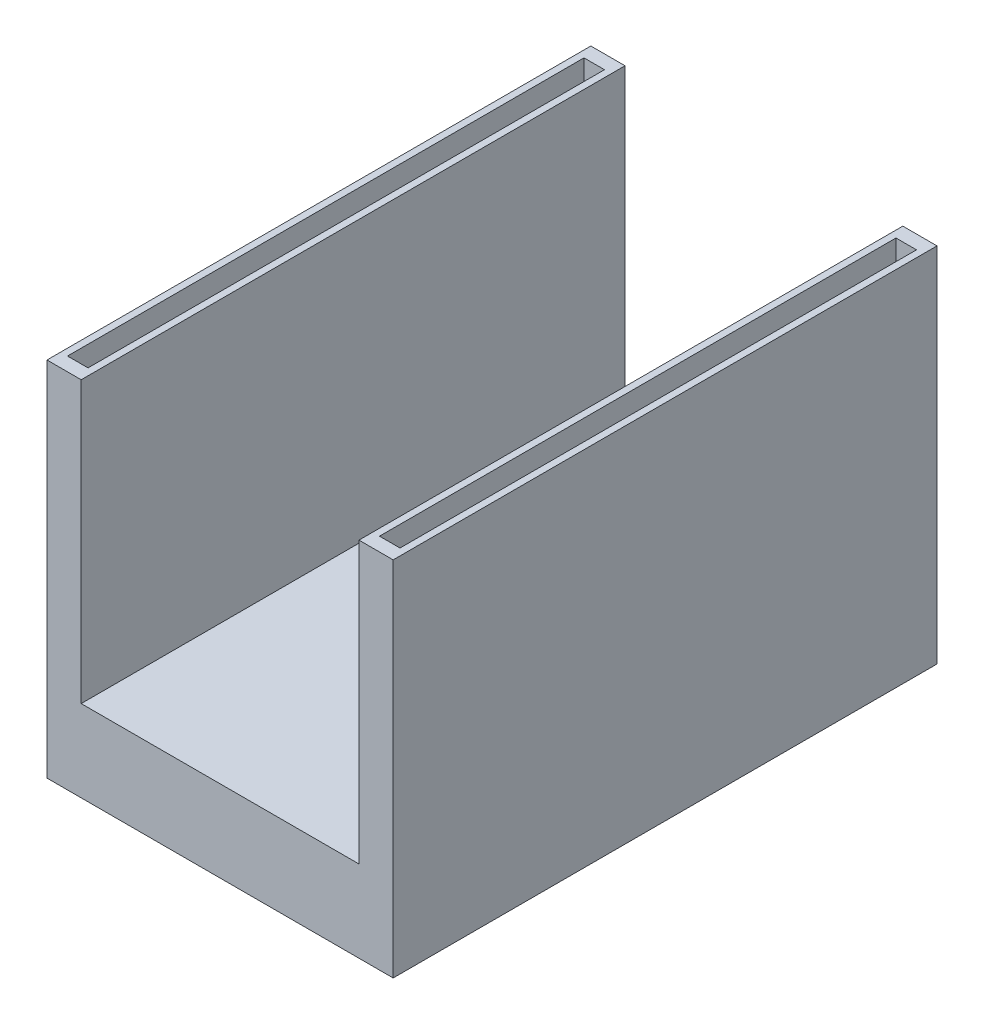
ISO-10303-21;
HEADER;
FILE_DESCRIPTION(('STEP AP214'),'2;1');
FILE_NAME('part.step','',(''),(''),'','','');
FILE_SCHEMA(('AUTOMOTIVE_DESIGN { 1 0 10303 214 1 1 1 1 }'));
ENDSEC;
DATA;
#1=APPLICATION_CONTEXT('core data for automotive mechanical design processes');
#2=APPLICATION_PROTOCOL_DEFINITION('international standard','automotive_design',2000,#1);
#3=PRODUCT_CONTEXT('',#1,'mechanical');
#4=PRODUCT('Part','Part','',(#3));
#5=PRODUCT_RELATED_PRODUCT_CATEGORY('part','',(#4));
#6=PRODUCT_DEFINITION_FORMATION('','',#4);
#7=PRODUCT_DEFINITION_CONTEXT('part definition',#1,'design');
#8=PRODUCT_DEFINITION('design','',#6,#7);
#9=PRODUCT_DEFINITION_SHAPE('','',#8);
#10=(LENGTH_UNIT() NAMED_UNIT(*) SI_UNIT(.MILLI.,.METRE.));
#11=(NAMED_UNIT(*) PLANE_ANGLE_UNIT() SI_UNIT($,.RADIAN.));
#12=(NAMED_UNIT(*) SI_UNIT($,.STERADIAN.) SOLID_ANGLE_UNIT());
#13=UNCERTAINTY_MEASURE_WITH_UNIT(LENGTH_MEASURE(1.E-05),#10,'distance_accuracy_value','');
#14=(GEOMETRIC_REPRESENTATION_CONTEXT(3) GLOBAL_UNCERTAINTY_ASSIGNED_CONTEXT((#13)) GLOBAL_UNIT_ASSIGNED_CONTEXT((#10,
#11,#12)) REPRESENTATION_CONTEXT('',''));
#15=CARTESIAN_POINT('',(0.,0.,0.));
#16=DIRECTION('',(0.,0.,1.));
#17=DIRECTION('',(1.,0.,0.));
#18=AXIS2_PLACEMENT_3D('',#15,#16,#17);
#19=CARTESIAN_POINT('',(101.212923353265,0.,159.));
#20=DIRECTION('',(0.,1.,0.));
#21=DIRECTION('',(-1.,0.,0.));
#22=AXIS2_PLACEMENT_3D('',#19,#20,#21);
#23=PLANE('',#22);
#24=DIRECTION('',(1.,0.,0.));
#25=VECTOR('',#24,1.);
#26=CARTESIAN_POINT('',(101.212923353265,0.,0.));
#27=LINE('',#26,#25);
#28=CARTESIAN_POINT('',(0.,0.,0.));
#29=VERTEX_POINT('',#28);
#30=CARTESIAN_POINT('',(101.212923353265,0.,0.));
#31=VERTEX_POINT('',#30);
#32=EDGE_CURVE('E208',#29,#31,#27,.T.);
#33=ORIENTED_EDGE('',*,*,#32,.T.);
#34=DIRECTION('',(0.,0.,-1.));
#35=VECTOR('',#34,1.);
#36=CARTESIAN_POINT('',(101.212923353265,0.,159.));
#37=LINE('',#36,#35);
#38=CARTESIAN_POINT('',(101.212923353265,0.,159.));
#39=VERTEX_POINT('',#38);
#40=EDGE_CURVE('E11',#39,#31,#37,.T.);
#41=ORIENTED_EDGE('',*,*,#40,.F.);
#42=DIRECTION('',(1.,0.,0.));
#43=VECTOR('',#42,1.);
#44=CARTESIAN_POINT('',(101.212923353265,0.,159.));
#45=LINE('',#44,#43);
#46=CARTESIAN_POINT('',(0.,0.,159.));
#47=VERTEX_POINT('',#46);
#48=EDGE_CURVE('E214',#47,#39,#45,.T.);
#49=ORIENTED_EDGE('',*,*,#48,.F.);
#50=DIRECTION('',(0.,0.,-1.));
#51=VECTOR('',#50,1.);
#52=CARTESIAN_POINT('',(0.,0.,159.));
#53=LINE('',#52,#51);
#54=EDGE_CURVE('E232',#47,#29,#53,.T.);
#55=ORIENTED_EDGE('',*,*,#54,.T.);
#56=EDGE_LOOP('',(#33,#41,#49,#55));
#57=FACE_BOUND('',#56,.T.);
#58=ADVANCED_FACE('F33',(#57),#23,.F.);
#59=CARTESIAN_POINT('',(101.212923353265,105.870341046064,159.));
#60=DIRECTION('',(-1.,0.,0.));
#61=DIRECTION('',(0.,-1.,0.));
#62=AXIS2_PLACEMENT_3D('',#59,#60,#61);
#63=PLANE('',#62);
#64=DIRECTION('',(0.,1.,0.));
#65=VECTOR('',#64,1.);
#66=CARTESIAN_POINT('',(101.212923353265,105.870341046064,0.));
#67=LINE('',#66,#65);
#68=CARTESIAN_POINT('',(101.212923353265,105.870341046064,0.));
#69=VERTEX_POINT('',#68);
#70=EDGE_CURVE('E235',#31,#69,#67,.T.);
#71=ORIENTED_EDGE('',*,*,#70,.T.);
#72=DIRECTION('',(0.,0.,-1.));
#73=VECTOR('',#72,1.);
#74=CARTESIAN_POINT('',(101.212923353265,105.870341046064,159.));
#75=LINE('',#74,#73);
#76=CARTESIAN_POINT('',(101.212923353265,105.870341046064,159.));
#77=VERTEX_POINT('',#76);
#78=EDGE_CURVE('E40',#77,#69,#75,.T.);
#79=ORIENTED_EDGE('',*,*,#78,.F.);
#80=DIRECTION('',(0.,1.,0.));
#81=VECTOR('',#80,1.);
#82=CARTESIAN_POINT('',(101.212923353265,105.870341046064,159.));
#83=LINE('',#82,#81);
#84=EDGE_CURVE('E217',#39,#77,#83,.T.);
#85=ORIENTED_EDGE('',*,*,#84,.F.);
#86=ORIENTED_EDGE('',*,*,#40,.T.);
#87=EDGE_LOOP('',(#71,#79,#85,#86));
#88=FACE_BOUND('',#87,.T.);
#89=ADVANCED_FACE('F292',(#88),#63,.F.);
#90=CARTESIAN_POINT('',(91.212923353265,105.870341046064,159.));
#91=DIRECTION('',(0.,-1.,0.));
#92=DIRECTION('',(0.,0.,-1.));
#93=AXIS2_PLACEMENT_3D('',#90,#91,#92);
#94=PLANE('',#93);
#95=DIRECTION('',(1.,0.,0.));
#96=VECTOR('',#95,1.);
#97=CARTESIAN_POINT('',(93.212923353265,105.870341046064,155.));
#98=LINE('',#97,#96);
#99=CARTESIAN_POINT('',(93.212923353265,105.870341046064,155.));
#100=VERTEX_POINT('',#99);
#101=CARTESIAN_POINT('',(99.212923353265,105.870341046064,155.));
#102=VERTEX_POINT('',#101);
#103=EDGE_CURVE('E174',#100,#102,#98,.T.);
#104=ORIENTED_EDGE('',*,*,#103,.F.);
#105=DIRECTION('',(0.,0.,1.));
#106=VECTOR('',#105,1.);
#107=CARTESIAN_POINT('',(93.212923353265,105.870341046064,4.));
#108=LINE('',#107,#106);
#109=CARTESIAN_POINT('',(93.212923353265,105.870341046064,4.));
#110=VERTEX_POINT('',#109);
#111=EDGE_CURVE('E47',#110,#100,#108,.T.);
#112=ORIENTED_EDGE('',*,*,#111,.F.);
#113=DIRECTION('',(-1.,0.,0.));
#114=VECTOR('',#113,1.);
#115=CARTESIAN_POINT('',(93.212923353265,105.870341046064,4.));
#116=LINE('',#115,#114);
#117=CARTESIAN_POINT('',(99.212923353265,105.870341046064,4.));
#118=VERTEX_POINT('',#117);
#119=EDGE_CURVE('E165',#118,#110,#116,.T.);
#120=ORIENTED_EDGE('',*,*,#119,.F.);
#121=DIRECTION('',(0.,0.,-1.));
#122=VECTOR('',#121,1.);
#123=CARTESIAN_POINT('',(99.212923353265,105.870341046064,4.));
#124=LINE('',#123,#122);
#125=EDGE_CURVE('E168',#102,#118,#124,.T.);
#126=ORIENTED_EDGE('',*,*,#125,.F.);
#127=EDGE_LOOP('',(#104,#112,#120,#126));
#128=FACE_BOUND('',#127,.T.);
#129=DIRECTION('',(-1.,0.,0.));
#130=VECTOR('',#129,1.);
#131=CARTESIAN_POINT('',(91.212923353265,105.870341046064,0.));
#132=LINE('',#131,#130);
#133=CARTESIAN_POINT('',(91.212923353265,105.870341046064,0.));
#134=VERTEX_POINT('',#133);
#135=EDGE_CURVE('E237',#69,#134,#132,.T.);
#136=ORIENTED_EDGE('',*,*,#135,.T.);
#137=DIRECTION('',(0.,0.,-1.));
#138=VECTOR('',#137,1.);
#139=CARTESIAN_POINT('',(91.212923353265,105.870341046064,159.));
#140=LINE('',#139,#138);
#141=CARTESIAN_POINT('',(91.212923353265,105.870341046064,159.));
#142=VERTEX_POINT('',#141);
#143=EDGE_CURVE('E262',#142,#134,#140,.T.);
#144=ORIENTED_EDGE('',*,*,#143,.F.);
#145=DIRECTION('',(-1.,0.,0.));
#146=VECTOR('',#145,1.);
#147=CARTESIAN_POINT('',(91.212923353265,105.870341046064,159.));
#148=LINE('',#147,#146);
#149=EDGE_CURVE('E220',#77,#142,#148,.T.);
#150=ORIENTED_EDGE('',*,*,#149,.F.);
#151=ORIENTED_EDGE('',*,*,#78,.T.);
#152=EDGE_LOOP('',(#136,#144,#150,#151));
#153=FACE_BOUND('',#152,.T.);
#154=ADVANCED_FACE('F269',(#128,#153),#94,.F.);
#155=CARTESIAN_POINT('',(91.212923353265,23.87275176668,159.));
#156=DIRECTION('',(1.,0.,0.));
#157=DIRECTION('',(0.,0.,-1.));
#158=AXIS2_PLACEMENT_3D('',#155,#156,#157);
#159=PLANE('',#158);
#160=DIRECTION('',(0.,-1.,0.));
#161=VECTOR('',#160,1.);
#162=CARTESIAN_POINT('',(91.212923353265,23.87275176668,0.));
#163=LINE('',#162,#161);
#164=CARTESIAN_POINT('',(91.212923353265,23.87275176668,0.));
#165=VERTEX_POINT('',#164);
#166=EDGE_CURVE('E239',#134,#165,#163,.T.);
#167=ORIENTED_EDGE('',*,*,#166,.T.);
#168=DIRECTION('',(0.,0.,-1.));
#169=VECTOR('',#168,1.);
#170=CARTESIAN_POINT('',(91.212923353265,23.87275176668,159.));
#171=LINE('',#170,#169);
#172=CARTESIAN_POINT('',(91.212923353265,23.87275176668,159.));
#173=VERTEX_POINT('',#172);
#174=EDGE_CURVE('E259',#173,#165,#171,.T.);
#175=ORIENTED_EDGE('',*,*,#174,.F.);
#176=DIRECTION('',(0.,-1.,0.));
#177=VECTOR('',#176,1.);
#178=CARTESIAN_POINT('',(91.212923353265,23.87275176668,159.));
#179=LINE('',#178,#177);
#180=EDGE_CURVE('E222',#142,#173,#179,.T.);
#181=ORIENTED_EDGE('',*,*,#180,.F.);
#182=ORIENTED_EDGE('',*,*,#143,.T.);
#183=EDGE_LOOP('',(#167,#175,#181,#182));
#184=FACE_BOUND('',#183,.T.);
#185=ADVANCED_FACE('F280',(#184),#159,.F.);
#186=CARTESIAN_POINT('',(10.,23.87275176668,159.));
#187=DIRECTION('',(0.,-1.,0.));
#188=DIRECTION('',(0.,0.,-1.));
#189=AXIS2_PLACEMENT_3D('',#186,#187,#188);
#190=PLANE('',#189);
#191=DIRECTION('',(-1.,0.,0.));
#192=VECTOR('',#191,1.);
#193=CARTESIAN_POINT('',(10.,23.87275176668,0.));
#194=LINE('',#193,#192);
#195=CARTESIAN_POINT('',(10.,23.87275176668,0.));
#196=VERTEX_POINT('',#195);
#197=EDGE_CURVE('E241',#165,#196,#194,.T.);
#198=ORIENTED_EDGE('',*,*,#197,.T.);
#199=DIRECTION('',(0.,0.,-1.));
#200=VECTOR('',#199,1.);
#201=CARTESIAN_POINT('',(10.,23.87275176668,159.));
#202=LINE('',#201,#200);
#203=CARTESIAN_POINT('',(10.,23.87275176668,159.));
#204=VERTEX_POINT('',#203);
#205=EDGE_CURVE('E256',#204,#196,#202,.T.);
#206=ORIENTED_EDGE('',*,*,#205,.F.);
#207=DIRECTION('',(-1.,0.,0.));
#208=VECTOR('',#207,1.);
#209=CARTESIAN_POINT('',(10.,23.87275176668,159.));
#210=LINE('',#209,#208);
#211=EDGE_CURVE('E224',#173,#204,#210,.T.);
#212=ORIENTED_EDGE('',*,*,#211,.F.);
#213=ORIENTED_EDGE('',*,*,#174,.T.);
#214=EDGE_LOOP('',(#198,#206,#212,#213));
#215=FACE_BOUND('',#214,.T.);
#216=ADVANCED_FACE('F284',(#215),#190,.F.);
#217=CARTESIAN_POINT('',(10.,105.870341046064,159.));
#218=DIRECTION('',(-1.,0.,0.));
#219=DIRECTION('',(0.,0.,1.));
#220=AXIS2_PLACEMENT_3D('',#217,#218,#219);
#221=PLANE('',#220);
#222=DIRECTION('',(0.,1.,0.));
#223=VECTOR('',#222,1.);
#224=CARTESIAN_POINT('',(10.,105.870341046064,0.));
#225=LINE('',#224,#223);
#226=CARTESIAN_POINT('',(10.,105.870341046064,0.));
#227=VERTEX_POINT('',#226);
#228=EDGE_CURVE('E243',#196,#227,#225,.T.);
#229=ORIENTED_EDGE('',*,*,#228,.T.);
#230=DIRECTION('',(0.,0.,-1.));
#231=VECTOR('',#230,1.);
#232=CARTESIAN_POINT('',(10.,105.870341046064,159.));
#233=LINE('',#232,#231);
#234=CARTESIAN_POINT('',(10.,105.870341046064,159.));
#235=VERTEX_POINT('',#234);
#236=EDGE_CURVE('E253',#235,#227,#233,.T.);
#237=ORIENTED_EDGE('',*,*,#236,.F.);
#238=DIRECTION('',(0.,1.,0.));
#239=VECTOR('',#238,1.);
#240=CARTESIAN_POINT('',(10.,105.870341046064,159.));
#241=LINE('',#240,#239);
#242=EDGE_CURVE('E226',#204,#235,#241,.T.);
#243=ORIENTED_EDGE('',*,*,#242,.F.);
#244=ORIENTED_EDGE('',*,*,#205,.T.);
#245=EDGE_LOOP('',(#229,#237,#243,#244));
#246=FACE_BOUND('',#245,.T.);
#247=ADVANCED_FACE('F305',(#246),#221,.F.);
#248=CARTESIAN_POINT('',(0.,105.870341046064,159.));
#249=DIRECTION('',(0.,-1.,0.));
#250=DIRECTION('',(0.,0.,-1.));
#251=AXIS2_PLACEMENT_3D('',#248,#249,#250);
#252=PLANE('',#251);
#253=DIRECTION('',(1.,0.,0.));
#254=VECTOR('',#253,1.);
#255=CARTESIAN_POINT('',(2.00000000000002,105.870341046064,155.));
#256=LINE('',#255,#254);
#257=CARTESIAN_POINT('',(2.00000000000002,105.870341046064,155.));
#258=VERTEX_POINT('',#257);
#259=CARTESIAN_POINT('',(8.00000000000002,105.870341046064,155.));
#260=VERTEX_POINT('',#259);
#261=EDGE_CURVE('E198',#258,#260,#256,.T.);
#262=ORIENTED_EDGE('',*,*,#261,.F.);
#263=DIRECTION('',(0.,0.,1.));
#264=VECTOR('',#263,1.);
#265=CARTESIAN_POINT('',(2.,105.870341046064,4.));
#266=LINE('',#265,#264);
#267=CARTESIAN_POINT('',(2.,105.870341046064,4.));
#268=VERTEX_POINT('',#267);
#269=EDGE_CURVE('E55',#268,#258,#266,.T.);
#270=ORIENTED_EDGE('',*,*,#269,.F.);
#271=DIRECTION('',(-1.,0.,0.));
#272=VECTOR('',#271,1.);
#273=CARTESIAN_POINT('',(2.,105.870341046064,4.));
#274=LINE('',#273,#272);
#275=CARTESIAN_POINT('',(8.,105.870341046064,4.));
#276=VERTEX_POINT('',#275);
#277=EDGE_CURVE('E187',#276,#268,#274,.T.);
#278=ORIENTED_EDGE('',*,*,#277,.F.);
#279=DIRECTION('',(0.,0.,-1.));
#280=VECTOR('',#279,1.);
#281=CARTESIAN_POINT('',(8.,105.870341046064,4.));
#282=LINE('',#281,#280);
#283=EDGE_CURVE('E201',#260,#276,#282,.T.);
#284=ORIENTED_EDGE('',*,*,#283,.F.);
#285=EDGE_LOOP('',(#262,#270,#278,#284));
#286=FACE_BOUND('',#285,.T.);
#287=DIRECTION('',(-1.,0.,0.));
#288=VECTOR('',#287,1.);
#289=CARTESIAN_POINT('',(0.,105.870341046064,0.));
#290=LINE('',#289,#288);
#291=CARTESIAN_POINT('',(0.,105.870341046064,0.));
#292=VERTEX_POINT('',#291);
#293=EDGE_CURVE('E245',#227,#292,#290,.T.);
#294=ORIENTED_EDGE('',*,*,#293,.T.);
#295=DIRECTION('',(0.,0.,-1.));
#296=VECTOR('',#295,1.);
#297=CARTESIAN_POINT('',(0.,105.870341046064,159.));
#298=LINE('',#297,#296);
#299=CARTESIAN_POINT('',(0.,105.870341046064,159.));
#300=VERTEX_POINT('',#299);
#301=EDGE_CURVE('E250',#300,#292,#298,.T.);
#302=ORIENTED_EDGE('',*,*,#301,.F.);
#303=DIRECTION('',(-1.,0.,0.));
#304=VECTOR('',#303,1.);
#305=CARTESIAN_POINT('',(0.,105.870341046064,159.));
#306=LINE('',#305,#304);
#307=EDGE_CURVE('E228',#235,#300,#306,.T.);
#308=ORIENTED_EDGE('',*,*,#307,.F.);
#309=ORIENTED_EDGE('',*,*,#236,.T.);
#310=EDGE_LOOP('',(#294,#302,#308,#309));
#311=FACE_BOUND('',#310,.T.);
#312=ADVANCED_FACE('F303',(#286,#311),#252,.F.);
#313=CARTESIAN_POINT('',(0.,0.,159.));
#314=DIRECTION('',(1.,0.,0.));
#315=DIRECTION('',(0.,0.,-1.));
#316=AXIS2_PLACEMENT_3D('',#313,#314,#315);
#317=PLANE('',#316);
#318=DIRECTION('',(0.,-1.,0.));
#319=VECTOR('',#318,1.);
#320=CARTESIAN_POINT('',(0.,0.,0.));
#321=LINE('',#320,#319);
#322=EDGE_CURVE('E218',#292,#29,#321,.T.);
#323=ORIENTED_EDGE('',*,*,#322,.T.);
#324=ORIENTED_EDGE('',*,*,#54,.F.);
#325=DIRECTION('',(0.,-1.,0.));
#326=VECTOR('',#325,1.);
#327=CARTESIAN_POINT('',(0.,0.,159.));
#328=LINE('',#327,#326);
#329=EDGE_CURVE('E230',#300,#47,#328,.T.);
#330=ORIENTED_EDGE('',*,*,#329,.F.);
#331=ORIENTED_EDGE('',*,*,#301,.T.);
#332=EDGE_LOOP('',(#323,#324,#330,#331));
#333=FACE_BOUND('',#332,.T.);
#334=ADVANCED_FACE('F298',(#333),#317,.F.);
#335=CARTESIAN_POINT('',(0.,0.,159.));
#336=DIRECTION('',(0.,0.,-1.));
#337=DIRECTION('',(-1.,0.,0.));
#338=AXIS2_PLACEMENT_3D('',#335,#336,#337);
#339=PLANE('',#338);
#340=ORIENTED_EDGE('',*,*,#48,.T.);
#341=ORIENTED_EDGE('',*,*,#84,.T.);
#342=ORIENTED_EDGE('',*,*,#149,.T.);
#343=ORIENTED_EDGE('',*,*,#180,.T.);
#344=ORIENTED_EDGE('',*,*,#211,.T.);
#345=ORIENTED_EDGE('',*,*,#242,.T.);
#346=ORIENTED_EDGE('',*,*,#307,.T.);
#347=ORIENTED_EDGE('',*,*,#329,.T.);
#348=EDGE_LOOP('',(#340,#341,#342,#343,#344,#345,#346,#347));
#349=FACE_BOUND('',#348,.T.);
#350=ADVANCED_FACE('F288',(#349),#339,.F.);
#351=CARTESIAN_POINT('',(0.,0.,0.));
#352=DIRECTION('',(0.,0.,-1.));
#353=DIRECTION('',(-1.,0.,0.));
#354=AXIS2_PLACEMENT_3D('',#351,#352,#353);
#355=PLANE('',#354);
#356=ORIENTED_EDGE('',*,*,#32,.F.);
#357=ORIENTED_EDGE('',*,*,#322,.F.);
#358=ORIENTED_EDGE('',*,*,#293,.F.);
#359=ORIENTED_EDGE('',*,*,#228,.F.);
#360=ORIENTED_EDGE('',*,*,#197,.F.);
#361=ORIENTED_EDGE('',*,*,#166,.F.);
#362=ORIENTED_EDGE('',*,*,#135,.F.);
#363=ORIENTED_EDGE('',*,*,#70,.F.);
#364=EDGE_LOOP('',(#356,#357,#358,#359,#360,#361,#362,#363));
#365=FACE_BOUND('',#364,.T.);
#366=ADVANCED_FACE('F275',(#365),#355,.T.);
#367=CARTESIAN_POINT('',(2.,85.8703410460636,4.));
#368=DIRECTION('',(-1.,0.,0.));
#369=DIRECTION('',(0.,0.,1.));
#370=AXIS2_PLACEMENT_3D('',#367,#368,#369);
#371=PLANE('',#370);
#372=ORIENTED_EDGE('',*,*,#269,.T.);
#373=DIRECTION('',(0.,1.,0.));
#374=VECTOR('',#373,1.);
#375=CARTESIAN_POINT('',(2.00000000000002,85.8703410460636,155.));
#376=LINE('',#375,#374);
#377=CARTESIAN_POINT('',(2.00000000000002,85.8703410460636,155.));
#378=VERTEX_POINT('',#377);
#379=EDGE_CURVE('E196',#378,#258,#376,.T.);
#380=ORIENTED_EDGE('',*,*,#379,.F.);
#381=DIRECTION('',(0.,0.,1.));
#382=VECTOR('',#381,1.);
#383=CARTESIAN_POINT('',(2.,85.8703410460636,4.));
#384=LINE('',#383,#382);
#385=CARTESIAN_POINT('',(2.,85.8703410460636,4.));
#386=VERTEX_POINT('',#385);
#387=EDGE_CURVE('E183',#386,#378,#384,.T.);
#388=ORIENTED_EDGE('',*,*,#387,.F.);
#389=DIRECTION('',(0.,1.,0.));
#390=VECTOR('',#389,1.);
#391=CARTESIAN_POINT('',(2.,85.8703410460636,4.));
#392=LINE('',#391,#390);
#393=EDGE_CURVE('E206',#386,#268,#392,.T.);
#394=ORIENTED_EDGE('',*,*,#393,.T.);
#395=EDGE_LOOP('',(#372,#380,#388,#394));
#396=FACE_BOUND('',#395,.T.);
#397=ADVANCED_FACE('F363',(#396),#371,.F.);
#398=CARTESIAN_POINT('',(2.,85.8703410460636,4.));
#399=DIRECTION('',(0.,0.,-1.));
#400=DIRECTION('',(-1.,0.,0.));
#401=AXIS2_PLACEMENT_3D('',#398,#399,#400);
#402=PLANE('',#401);
#403=ORIENTED_EDGE('',*,*,#277,.T.);
#404=ORIENTED_EDGE('',*,*,#393,.F.);
#405=DIRECTION('',(-1.,0.,0.));
#406=VECTOR('',#405,1.);
#407=CARTESIAN_POINT('',(2.,85.8703410460636,4.));
#408=LINE('',#407,#406);
#409=CARTESIAN_POINT('',(8.,85.8703410460636,4.));
#410=VERTEX_POINT('',#409);
#411=EDGE_CURVE('E193',#410,#386,#408,.T.);
#412=ORIENTED_EDGE('',*,*,#411,.F.);
#413=DIRECTION('',(0.,1.,0.));
#414=VECTOR('',#413,1.);
#415=CARTESIAN_POINT('',(8.,85.8703410460636,4.));
#416=LINE('',#415,#414);
#417=EDGE_CURVE('E209',#410,#276,#416,.T.);
#418=ORIENTED_EDGE('',*,*,#417,.T.);
#419=EDGE_LOOP('',(#403,#404,#412,#418));
#420=FACE_BOUND('',#419,.T.);
#421=ADVANCED_FACE('F383',(#420),#402,.F.);
#422=CARTESIAN_POINT('',(8.,85.8703410460636,4.));
#423=DIRECTION('',(1.,0.,0.));
#424=DIRECTION('',(0.,0.,-1.));
#425=AXIS2_PLACEMENT_3D('',#422,#423,#424);
#426=PLANE('',#425);
#427=ORIENTED_EDGE('',*,*,#283,.T.);
#428=ORIENTED_EDGE('',*,*,#417,.F.);
#429=DIRECTION('',(0.,0.,-1.));
#430=VECTOR('',#429,1.);
#431=CARTESIAN_POINT('',(8.,85.8703410460636,4.));
#432=LINE('',#431,#430);
#433=CARTESIAN_POINT('',(8.00000000000002,85.8703410460636,155.));
#434=VERTEX_POINT('',#433);
#435=EDGE_CURVE('E190',#434,#410,#432,.T.);
#436=ORIENTED_EDGE('',*,*,#435,.F.);
#437=DIRECTION('',(0.,1.,0.));
#438=VECTOR('',#437,1.);
#439=CARTESIAN_POINT('',(8.00000000000002,85.8703410460636,155.));
#440=LINE('',#439,#438);
#441=EDGE_CURVE('E211',#434,#260,#440,.T.);
#442=ORIENTED_EDGE('',*,*,#441,.T.);
#443=EDGE_LOOP('',(#427,#428,#436,#442));
#444=FACE_BOUND('',#443,.T.);
#445=ADVANCED_FACE('F392',(#444),#426,.F.);
#446=CARTESIAN_POINT('',(2.00000000000002,85.8703410460636,155.));
#447=DIRECTION('',(0.,0.,1.));
#448=DIRECTION('',(1.,0.,0.));
#449=AXIS2_PLACEMENT_3D('',#446,#447,#448);
#450=PLANE('',#449);
#451=ORIENTED_EDGE('',*,*,#261,.T.);
#452=ORIENTED_EDGE('',*,*,#441,.F.);
#453=DIRECTION('',(1.,0.,0.));
#454=VECTOR('',#453,1.);
#455=CARTESIAN_POINT('',(2.00000000000002,85.8703410460636,155.));
#456=LINE('',#455,#454);
#457=EDGE_CURVE('E186',#378,#434,#456,.T.);
#458=ORIENTED_EDGE('',*,*,#457,.F.);
#459=ORIENTED_EDGE('',*,*,#379,.T.);
#460=EDGE_LOOP('',(#451,#452,#458,#459));
#461=FACE_BOUND('',#460,.T.);
#462=ADVANCED_FACE('F402',(#461),#450,.F.);
#463=CARTESIAN_POINT('',(0.,85.8703410460636,0.));
#464=DIRECTION('',(0.,1.,0.));
#465=DIRECTION('',(0.,0.,1.));
#466=AXIS2_PLACEMENT_3D('',#463,#464,#465);
#467=PLANE('',#466);
#468=ORIENTED_EDGE('',*,*,#387,.T.);
#469=ORIENTED_EDGE('',*,*,#457,.T.);
#470=ORIENTED_EDGE('',*,*,#435,.T.);
#471=ORIENTED_EDGE('',*,*,#411,.T.);
#472=EDGE_LOOP('',(#468,#469,#470,#471));
#473=FACE_BOUND('',#472,.T.);
#474=ADVANCED_FACE('F412',(#473),#467,.T.);
#475=CARTESIAN_POINT('',(93.212923353265,85.8703410460636,4.));
#476=DIRECTION('',(-1.,0.,0.));
#477=DIRECTION('',(0.,0.,1.));
#478=AXIS2_PLACEMENT_3D('',#475,#476,#477);
#479=PLANE('',#478);
#480=ORIENTED_EDGE('',*,*,#111,.T.);
#481=DIRECTION('',(0.,1.,0.));
#482=VECTOR('',#481,1.);
#483=CARTESIAN_POINT('',(93.212923353265,85.8703410460636,155.));
#484=LINE('',#483,#482);
#485=CARTESIAN_POINT('',(93.212923353265,85.8703410460636,155.));
#486=VERTEX_POINT('',#485);
#487=EDGE_CURVE('E143',#486,#100,#484,.T.);
#488=ORIENTED_EDGE('',*,*,#487,.F.);
#489=DIRECTION('',(0.,0.,1.));
#490=VECTOR('',#489,1.);
#491=CARTESIAN_POINT('',(93.212923353265,85.8703410460636,4.));
#492=LINE('',#491,#490);
#493=CARTESIAN_POINT('',(93.212923353265,85.8703410460636,4.));
#494=VERTEX_POINT('',#493);
#495=EDGE_CURVE('E147',#494,#486,#492,.T.);
#496=ORIENTED_EDGE('',*,*,#495,.F.);
#497=DIRECTION('',(0.,1.,0.));
#498=VECTOR('',#497,1.);
#499=CARTESIAN_POINT('',(93.212923353265,85.8703410460636,4.));
#500=LINE('',#499,#498);
#501=EDGE_CURVE('E178',#494,#110,#500,.T.);
#502=ORIENTED_EDGE('',*,*,#501,.T.);
#503=EDGE_LOOP('',(#480,#488,#496,#502));
#504=FACE_BOUND('',#503,.T.);
#505=ADVANCED_FACE('F145',(#504),#479,.F.);
#506=CARTESIAN_POINT('',(93.212923353265,85.8703410460636,4.));
#507=DIRECTION('',(0.,0.,-1.));
#508=DIRECTION('',(-1.,0.,0.));
#509=AXIS2_PLACEMENT_3D('',#506,#507,#508);
#510=PLANE('',#509);
#511=ORIENTED_EDGE('',*,*,#119,.T.);
#512=ORIENTED_EDGE('',*,*,#501,.F.);
#513=DIRECTION('',(-1.,0.,0.));
#514=VECTOR('',#513,1.);
#515=CARTESIAN_POINT('',(93.212923353265,85.8703410460636,4.));
#516=LINE('',#515,#514);
#517=CARTESIAN_POINT('',(99.212923353265,85.8703410460636,4.));
#518=VERTEX_POINT('',#517);
#519=EDGE_CURVE('E153',#518,#494,#516,.T.);
#520=ORIENTED_EDGE('',*,*,#519,.F.);
#521=DIRECTION('',(0.,1.,0.));
#522=VECTOR('',#521,1.);
#523=CARTESIAN_POINT('',(99.212923353265,85.8703410460636,4.));
#524=LINE('',#523,#522);
#525=EDGE_CURVE('E180',#518,#118,#524,.T.);
#526=ORIENTED_EDGE('',*,*,#525,.T.);
#527=EDGE_LOOP('',(#511,#512,#520,#526));
#528=FACE_BOUND('',#527,.T.);
#529=ADVANCED_FACE('F431',(#528),#510,.F.);
#530=CARTESIAN_POINT('',(99.212923353265,85.8703410460636,4.));
#531=DIRECTION('',(1.,0.,0.));
#532=DIRECTION('',(0.,0.,-1.));
#533=AXIS2_PLACEMENT_3D('',#530,#531,#532);
#534=PLANE('',#533);
#535=ORIENTED_EDGE('',*,*,#125,.T.);
#536=ORIENTED_EDGE('',*,*,#525,.F.);
#537=DIRECTION('',(0.,0.,-1.));
#538=VECTOR('',#537,1.);
#539=CARTESIAN_POINT('',(99.212923353265,85.8703410460636,4.));
#540=LINE('',#539,#538);
#541=CARTESIAN_POINT('',(99.212923353265,85.8703410460636,155.));
#542=VERTEX_POINT('',#541);
#543=EDGE_CURVE('E161',#542,#518,#540,.T.);
#544=ORIENTED_EDGE('',*,*,#543,.F.);
#545=DIRECTION('',(0.,1.,0.));
#546=VECTOR('',#545,1.);
#547=CARTESIAN_POINT('',(99.212923353265,85.8703410460636,155.));
#548=LINE('',#547,#546);
#549=EDGE_CURVE('E152',#542,#102,#548,.T.);
#550=ORIENTED_EDGE('',*,*,#549,.T.);
#551=EDGE_LOOP('',(#535,#536,#544,#550));
#552=FACE_BOUND('',#551,.T.);
#553=ADVANCED_FACE('F440',(#552),#534,.F.);
#554=CARTESIAN_POINT('',(93.212923353265,85.8703410460636,155.));
#555=DIRECTION('',(0.,0.,1.));
#556=DIRECTION('',(1.,0.,0.));
#557=AXIS2_PLACEMENT_3D('',#554,#555,#556);
#558=PLANE('',#557);
#559=ORIENTED_EDGE('',*,*,#103,.T.);
#560=ORIENTED_EDGE('',*,*,#549,.F.);
#561=DIRECTION('',(1.,0.,0.));
#562=VECTOR('',#561,1.);
#563=CARTESIAN_POINT('',(93.212923353265,85.8703410460636,155.));
#564=LINE('',#563,#562);
#565=EDGE_CURVE('E156',#486,#542,#564,.T.);
#566=ORIENTED_EDGE('',*,*,#565,.F.);
#567=ORIENTED_EDGE('',*,*,#487,.T.);
#568=EDGE_LOOP('',(#559,#560,#566,#567));
#569=FACE_BOUND('',#568,.T.);
#570=ADVANCED_FACE('F157',(#569),#558,.F.);
#571=CARTESIAN_POINT('',(0.,85.8703410460636,0.));
#572=DIRECTION('',(0.,1.,0.));
#573=DIRECTION('',(0.,0.,1.));
#574=AXIS2_PLACEMENT_3D('',#571,#572,#573);
#575=PLANE('',#574);
#576=ORIENTED_EDGE('',*,*,#495,.T.);
#577=ORIENTED_EDGE('',*,*,#565,.T.);
#578=ORIENTED_EDGE('',*,*,#543,.T.);
#579=ORIENTED_EDGE('',*,*,#519,.T.);
#580=EDGE_LOOP('',(#576,#577,#578,#579));
#581=FACE_BOUND('',#580,.T.);
#582=ADVANCED_FACE('F163',(#581),#575,.T.);
#583=CLOSED_SHELL('',(#58,#89,#154,#185,#216,#247,#312,#334,#350,#366,#397,#421,#445,#462,#474,
#505,#529,#553,#570,#582));
#584=MANIFOLD_SOLID_BREP('B2',#583);
#585=ADVANCED_BREP_SHAPE_REPRESENTATION('',(#18,#584),#14);
#586=SHAPE_DEFINITION_REPRESENTATION(#9,#585);
ENDSEC;
END-ISO-10303-21;
